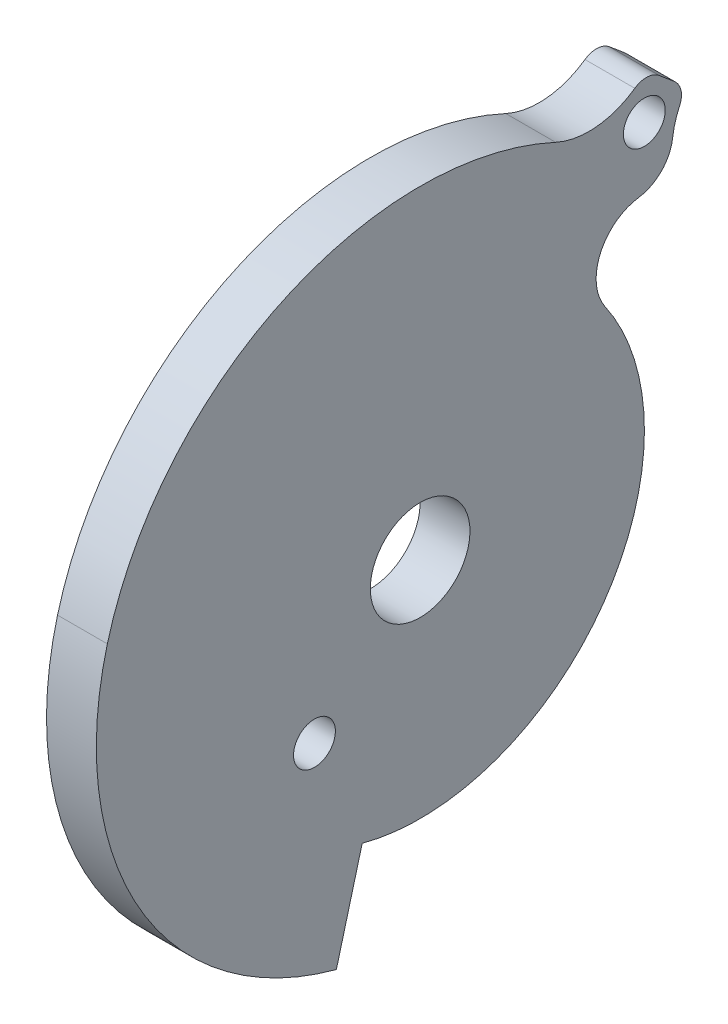
ISO-10303-21;
HEADER;
FILE_DESCRIPTION(('STEP AP214'),'2;1');
FILE_NAME('part.step','',(''),(''),'','','');
FILE_SCHEMA(('AUTOMOTIVE_DESIGN { 1 0 10303 214 1 1 1 1 }'));
ENDSEC;
DATA;
#1=APPLICATION_CONTEXT('core data for automotive mechanical design processes');
#2=APPLICATION_PROTOCOL_DEFINITION('international standard','automotive_design',2000,#1);
#3=PRODUCT_CONTEXT('',#1,'mechanical');
#4=PRODUCT('Part','Part','',(#3));
#5=PRODUCT_RELATED_PRODUCT_CATEGORY('part','',(#4));
#6=PRODUCT_DEFINITION_FORMATION('','',#4);
#7=PRODUCT_DEFINITION_CONTEXT('part definition',#1,'design');
#8=PRODUCT_DEFINITION('design','',#6,#7);
#9=PRODUCT_DEFINITION_SHAPE('','',#8);
#10=(LENGTH_UNIT() NAMED_UNIT(*) SI_UNIT(.MILLI.,.METRE.));
#11=(NAMED_UNIT(*) PLANE_ANGLE_UNIT() SI_UNIT($,.RADIAN.));
#12=(NAMED_UNIT(*) SI_UNIT($,.STERADIAN.) SOLID_ANGLE_UNIT());
#13=UNCERTAINTY_MEASURE_WITH_UNIT(LENGTH_MEASURE(1.E-05),#10,'distance_accuracy_value','');
#14=(GEOMETRIC_REPRESENTATION_CONTEXT(3) GLOBAL_UNCERTAINTY_ASSIGNED_CONTEXT((#13)) GLOBAL_UNIT_ASSIGNED_CONTEXT((#10,
#11,#12)) REPRESENTATION_CONTEXT('',''));
#15=CARTESIAN_POINT('',(0.,0.,0.));
#16=DIRECTION('',(0.,0.,1.));
#17=DIRECTION('',(1.,0.,0.));
#18=AXIS2_PLACEMENT_3D('',#15,#16,#17);
#19=CARTESIAN_POINT('',(0.,28.8354335294882,-25.5094848534449));
#20=DIRECTION('',(0.,0.766044443118984,-0.642787609686533));
#21=DIRECTION('',(-1.,0.,0.));
#22=AXIS2_PLACEMENT_3D('',#19,#20,#21);
#23=PLANE('',#22);
#24=DIRECTION('',(1.,0.,0.));
#25=VECTOR('',#24,1.);
#26=CARTESIAN_POINT('',(0.,30.1210087488613,-23.9773959672069));
#27=LINE('',#26,#25);
#28=CARTESIAN_POINT('',(-2.5,30.1210087488613,-23.9773959672069));
#29=VERTEX_POINT('',#28);
#30=CARTESIAN_POINT('',(2.5,30.1210087488613,-23.9773959672069));
#31=VERTEX_POINT('',#30);
#32=EDGE_CURVE('E125',#29,#31,#27,.T.);
#33=ORIENTED_EDGE('',*,*,#32,.T.);
#34=DIRECTION('',(0.,0.642787609686533,0.766044443118983));
#35=VECTOR('',#34,1.);
#36=CARTESIAN_POINT('',(2.5,28.8354335294882,-25.5094848534449));
#37=LINE('',#36,#35);
#38=CARTESIAN_POINT('',(2.5,28.8354335294882,-25.5094848534449));
#39=VERTEX_POINT('',#38);
#40=EDGE_CURVE('E217',#39,#31,#37,.T.);
#41=ORIENTED_EDGE('',*,*,#40,.F.);
#42=DIRECTION('',(1.,0.,0.));
#43=VECTOR('',#42,1.);
#44=CARTESIAN_POINT('',(0.,28.8354335294882,-25.5094848534449));
#45=LINE('',#44,#43);
#46=CARTESIAN_POINT('',(-2.5,28.8354335294882,-25.5094848534449));
#47=VERTEX_POINT('',#46);
#48=EDGE_CURVE('E170',#47,#39,#45,.T.);
#49=ORIENTED_EDGE('',*,*,#48,.F.);
#50=DIRECTION('',(0.,-0.642787609686533,-0.766044443118983));
#51=VECTOR('',#50,1.);
#52=CARTESIAN_POINT('',(-2.5,28.8354335294882,-25.5094848534449));
#53=LINE('',#52,#51);
#54=EDGE_CURVE('E135',#29,#47,#53,.T.);
#55=ORIENTED_EDGE('',*,*,#54,.F.);
#56=EDGE_LOOP('',(#33,#41,#49,#55));
#57=FACE_BOUND('',#56,.T.);
#58=ADVANCED_FACE('F17',(#57),#23,.T.);
#59=CARTESIAN_POINT('',(0.,-0.0144899209046523,0.00388256260460906));
#60=DIRECTION('',(1.,0.,0.));
#61=DIRECTION('',(0.,1.,0.));
#62=AXIS2_PLACEMENT_3D('',#59,#60,#61);
#63=CYLINDRICAL_SURFACE('',#62,32.5);
#64=DIRECTION('',(1.,0.,0.));
#65=VECTOR('',#64,1.);
#66=CARTESIAN_POINT('',(2.5,8.40437378099898,31.3945297997797));
#67=LINE('',#66,#65);
#68=CARTESIAN_POINT('',(-2.5,8.40437378100052,31.3945297997793));
#69=VERTEX_POINT('',#68);
#70=CARTESIAN_POINT('',(2.5,8.40437378100052,31.3945297997793));
#71=VERTEX_POINT('',#70);
#72=EDGE_CURVE('E21',#69,#71,#67,.T.);
#73=ORIENTED_EDGE('',*,*,#72,.T.);
#74=CARTESIAN_POINT('',(2.5,-0.0144899209046523,0.00388256260460906));
#75=DIRECTION('',(1.,0.,0.));
#76=DIRECTION('',(0.,1.,0.));
#77=AXIS2_PLACEMENT_3D('',#74,#75,#76);
#78=CIRCLE('',#77,32.5);
#79=CARTESIAN_POINT('',(2.5,29.5040355146327,-13.5941561236005));
#80=VERTEX_POINT('',#79);
#81=EDGE_CURVE('E152',#80,#71,#78,.T.);
#82=ORIENTED_EDGE('',*,*,#81,.F.);
#83=DIRECTION('',(1.,0.,0.));
#84=VECTOR('',#83,1.);
#85=CARTESIAN_POINT('',(0.,29.5040355146328,-13.5941561236005));
#86=LINE('',#85,#84);
#87=CARTESIAN_POINT('',(-2.5,29.5040355146327,-13.5941561236005));
#88=VERTEX_POINT('',#87);
#89=EDGE_CURVE('E126',#88,#80,#86,.T.);
#90=ORIENTED_EDGE('',*,*,#89,.F.);
#91=CARTESIAN_POINT('',(-2.5,-0.0144899209046523,0.00388256260460906));
#92=DIRECTION('',(-1.,0.,0.));
#93=DIRECTION('',(0.,1.,0.));
#94=AXIS2_PLACEMENT_3D('',#91,#92,#93);
#95=CIRCLE('',#94,32.5);
#96=EDGE_CURVE('E141',#69,#88,#95,.T.);
#97=ORIENTED_EDGE('',*,*,#96,.F.);
#98=EDGE_LOOP('',(#73,#82,#90,#97));
#99=FACE_BOUND('',#98,.T.);
#100=ADVANCED_FACE('F272',(#99),#63,.T.);
#101=CARTESIAN_POINT('',(0.,-10.6210916387027,10.610484280403));
#102=DIRECTION('',(1.,0.,0.));
#103=DIRECTION('',(0.,-1.,0.));
#104=AXIS2_PLACEMENT_3D('',#101,#102,#103);
#105=CYLINDRICAL_SURFACE('',#104,2.1);
#106=CARTESIAN_POINT('',(2.5,-10.6210916387027,10.610484280403));
#107=DIRECTION('',(-1.,0.,0.));
#108=DIRECTION('',(0.,-1.,0.));
#109=AXIS2_PLACEMENT_3D('',#106,#107,#108);
#110=CIRCLE('',#109,2.1);
#111=CARTESIAN_POINT('',(2.5,-8.52109163870272,10.610484280403));
#112=VERTEX_POINT('',#111);
#113=EDGE_CURVE('E163',#112,#112,#110,.T.);
#114=ORIENTED_EDGE('',*,*,#113,.F.);
#115=DIRECTION('',(-1.,0.,0.));
#116=VECTOR('',#115,1.);
#117=CARTESIAN_POINT('',(0.,-8.52109163870273,10.610484280403));
#118=LINE('',#117,#116);
#119=CARTESIAN_POINT('',(-2.5,-8.52109163870272,10.610484280403));
#120=VERTEX_POINT('',#119);
#121=EDGE_CURVE('E11',#112,#120,#118,.T.);
#122=ORIENTED_EDGE('',*,*,#121,.T.);
#123=CARTESIAN_POINT('',(-2.5,-10.6210916387027,10.610484280403));
#124=DIRECTION('',(1.,0.,0.));
#125=DIRECTION('',(0.,-1.,0.));
#126=AXIS2_PLACEMENT_3D('',#123,#124,#125);
#127=CIRCLE('',#126,2.1);
#128=EDGE_CURVE('E179',#120,#120,#127,.T.);
#129=ORIENTED_EDGE('',*,*,#128,.F.);
#130=ORIENTED_EDGE('',*,*,#121,.F.);
#131=EDGE_LOOP('',(#114,#122,#129,#130));
#132=FACE_BOUND('',#131,.T.);
#133=ADVANCED_FACE('F19',(#132),#105,.F.);
#134=CARTESIAN_POINT('',(0.,-0.0038825626047867,0.0038825626047867));
#135=DIRECTION('',(1.,0.,0.));
#136=DIRECTION('',(0.,-1.,0.));
#137=AXIS2_PLACEMENT_3D('',#134,#135,#136);
#138=CYLINDRICAL_SURFACE('',#137,5.);
#139=CARTESIAN_POINT('',(2.5,-0.0038825626047867,0.0038825626047867));
#140=DIRECTION('',(-1.,0.,0.));
#141=DIRECTION('',(0.,-1.,0.));
#142=AXIS2_PLACEMENT_3D('',#139,#140,#141);
#143=CIRCLE('',#142,5.);
#144=CARTESIAN_POINT('',(2.5,4.99611743739521,0.0038825626047867));
#145=VERTEX_POINT('',#144);
#146=EDGE_CURVE('E167',#145,#145,#143,.T.);
#147=ORIENTED_EDGE('',*,*,#146,.F.);
#148=DIRECTION('',(-1.,0.,0.));
#149=VECTOR('',#148,1.);
#150=CARTESIAN_POINT('',(0.,4.99611743739521,0.00388256260478731));
#151=LINE('',#150,#149);
#152=CARTESIAN_POINT('',(-2.5,4.99611743739521,0.0038825626047867));
#153=VERTEX_POINT('',#152);
#154=EDGE_CURVE('E28',#145,#153,#151,.T.);
#155=ORIENTED_EDGE('',*,*,#154,.T.);
#156=CARTESIAN_POINT('',(-2.5,-0.0038825626047867,0.0038825626047867));
#157=DIRECTION('',(1.,0.,0.));
#158=DIRECTION('',(0.,-1.,0.));
#159=AXIS2_PLACEMENT_3D('',#156,#157,#158);
#160=CIRCLE('',#159,5.);
#161=EDGE_CURVE('E184',#153,#153,#160,.T.);
#162=ORIENTED_EDGE('',*,*,#161,.F.);
#163=ORIENTED_EDGE('',*,*,#154,.F.);
#164=EDGE_LOOP('',(#147,#155,#162,#163));
#165=FACE_BOUND('',#164,.T.);
#166=ADVANCED_FACE('F373',(#165),#138,.F.);
#167=CARTESIAN_POINT('',(0.,26.7970655882598,-22.4936837764244));
#168=DIRECTION('',(1.,0.,0.));
#169=DIRECTION('',(0.,-1.,0.));
#170=AXIS2_PLACEMENT_3D('',#167,#168,#169);
#171=CYLINDRICAL_SURFACE('',#170,2.1);
#172=CARTESIAN_POINT('',(2.5,26.7970655882598,-22.4936837764244));
#173=DIRECTION('',(-1.,0.,0.));
#174=DIRECTION('',(0.,-1.,0.));
#175=AXIS2_PLACEMENT_3D('',#172,#173,#174);
#176=CIRCLE('',#175,2.1);
#177=CARTESIAN_POINT('',(2.5,28.8970655882598,-22.4936837764244));
#178=VERTEX_POINT('',#177);
#179=EDGE_CURVE('E226',#178,#178,#176,.T.);
#180=ORIENTED_EDGE('',*,*,#179,.F.);
#181=DIRECTION('',(-1.,0.,0.));
#182=VECTOR('',#181,1.);
#183=CARTESIAN_POINT('',(0.,28.8970655882598,-22.4936837764244));
#184=LINE('',#183,#182);
#185=CARTESIAN_POINT('',(-2.5,28.8970655882598,-22.4936837764244));
#186=VERTEX_POINT('',#185);
#187=EDGE_CURVE('E257',#178,#186,#184,.T.);
#188=ORIENTED_EDGE('',*,*,#187,.T.);
#189=CARTESIAN_POINT('',(-2.5,26.7970655882598,-22.4936837764244));
#190=DIRECTION('',(1.,0.,0.));
#191=DIRECTION('',(0.,-1.,0.));
#192=AXIS2_PLACEMENT_3D('',#189,#190,#191);
#193=CIRCLE('',#192,2.1);
#194=EDGE_CURVE('E188',#186,#186,#193,.T.);
#195=ORIENTED_EDGE('',*,*,#194,.F.);
#196=ORIENTED_EDGE('',*,*,#187,.F.);
#197=EDGE_LOOP('',(#180,#188,#195,#196));
#198=FACE_BOUND('',#197,.T.);
#199=ADVANCED_FACE('F367',(#198),#171,.F.);
#200=CARTESIAN_POINT('',(0.,28.5889198626233,-22.6918207478339));
#201=DIRECTION('',(1.,0.,0.));
#202=DIRECTION('',(0.,0.766044443118982,-0.642787609686534));
#203=AXIS2_PLACEMENT_3D('',#200,#201,#202);
#204=CYLINDRICAL_SURFACE('',#203,2.);
#205=DIRECTION('',(-1.,0.,0.));
#206=VECTOR('',#205,1.);
#207=CARTESIAN_POINT('',(0.,30.2251627067747,-21.5417297275388));
#208=LINE('',#207,#206);
#209=CARTESIAN_POINT('',(2.5,30.2251627067747,-21.5417297275388));
#210=VERTEX_POINT('',#209);
#211=CARTESIAN_POINT('',(-2.5,30.2251627067747,-21.5417297275388));
#212=VERTEX_POINT('',#211);
#213=EDGE_CURVE('E113',#210,#212,#208,.T.);
#214=ORIENTED_EDGE('',*,*,#213,.F.);
#215=CARTESIAN_POINT('',(2.5,28.5889198626233,-22.6918207478339));
#216=DIRECTION('',(1.,0.,0.));
#217=DIRECTION('',(0.,0.766044443118982,-0.642787609686534));
#218=AXIS2_PLACEMENT_3D('',#215,#216,#217);
#219=CIRCLE('',#218,2.);
#220=EDGE_CURVE('E214',#31,#210,#219,.T.);
#221=ORIENTED_EDGE('',*,*,#220,.F.);
#222=ORIENTED_EDGE('',*,*,#32,.F.);
#223=CARTESIAN_POINT('',(-2.5,28.5889198626233,-22.6918207478339));
#224=DIRECTION('',(-1.,0.,0.));
#225=DIRECTION('',(0.,0.766044443118982,-0.642787609686534));
#226=AXIS2_PLACEMENT_3D('',#223,#224,#225);
#227=CIRCLE('',#226,2.);
#228=EDGE_CURVE('E128',#212,#29,#227,.T.);
#229=ORIENTED_EDGE('',*,*,#228,.F.);
#230=EDGE_LOOP('',(#214,#221,#222,#229));
#231=FACE_BOUND('',#230,.T.);
#232=ADVANCED_FACE('F129',(#231),#204,.T.);
#233=CARTESIAN_POINT('',(0.,36.7701340833804,-16.9413656463587));
#234=DIRECTION('',(-1.,0.,0.));
#235=DIRECTION('',(0.,0.818121422075711,0.575045510147516));
#236=AXIS2_PLACEMENT_3D('',#233,#234,#235);
#237=CYLINDRICAL_SURFACE('',#236,8.);
#238=CARTESIAN_POINT('',(-2.5,36.7701340833804,-16.9413656463587));
#239=DIRECTION('',(1.,0.,0.));
#240=DIRECTION('',(0.,0.818121422075711,0.575045510147516));
#241=AXIS2_PLACEMENT_3D('',#238,#239,#240);
#242=CIRCLE('',#241,8.);
#243=EDGE_CURVE('E117',#88,#212,#242,.T.);
#244=ORIENTED_EDGE('',*,*,#243,.F.);
#245=ORIENTED_EDGE('',*,*,#89,.T.);
#246=CARTESIAN_POINT('',(2.5,36.7701340833804,-16.9413656463587));
#247=DIRECTION('',(1.,0.,0.));
#248=DIRECTION('',(0.,0.818121422075711,0.575045510147516));
#249=AXIS2_PLACEMENT_3D('',#246,#247,#248);
#250=CIRCLE('',#249,8.);
#251=EDGE_CURVE('E120',#80,#210,#250,.T.);
#252=ORIENTED_EDGE('',*,*,#251,.T.);
#253=ORIENTED_EDGE('',*,*,#213,.T.);
#254=EDGE_LOOP('',(#244,#245,#252,#253));
#255=FACE_BOUND('',#254,.T.);
#256=ADVANCED_FACE('F115',(#255),#237,.F.);
#257=CARTESIAN_POINT('',(0.,27.3033446432503,-24.2239096340718));
#258=DIRECTION('',(1.,0.,0.));
#259=DIRECTION('',(0.,-0.642787609686537,-0.76604444311898));
#260=AXIS2_PLACEMENT_3D('',#257,#258,#259);
#261=CYLINDRICAL_SURFACE('',#260,2.);
#262=DIRECTION('',(1.,0.,0.));
#263=VECTOR('',#262,1.);
#264=CARTESIAN_POINT('',(0.,26.4548566779015,-26.0350054826282));
#265=LINE('',#264,#263);
#266=CARTESIAN_POINT('',(-2.5,26.4548566779015,-26.0350054826282));
#267=VERTEX_POINT('',#266);
#268=CARTESIAN_POINT('',(2.5,26.4548566779015,-26.0350054826282));
#269=VERTEX_POINT('',#268);
#270=EDGE_CURVE('E166',#267,#269,#265,.T.);
#271=ORIENTED_EDGE('',*,*,#270,.F.);
#272=CARTESIAN_POINT('',(-2.5,27.3033446432503,-24.2239096340718));
#273=DIRECTION('',(-1.,0.,0.));
#274=DIRECTION('',(0.,-0.642787609686537,-0.76604444311898));
#275=AXIS2_PLACEMENT_3D('',#272,#273,#274);
#276=CIRCLE('',#275,2.);
#277=EDGE_CURVE('E218',#47,#267,#276,.T.);
#278=ORIENTED_EDGE('',*,*,#277,.F.);
#279=ORIENTED_EDGE('',*,*,#48,.T.);
#280=CARTESIAN_POINT('',(2.5,27.3033446432503,-24.2239096340718));
#281=DIRECTION('',(1.,0.,0.));
#282=DIRECTION('',(0.,-0.642787609686537,-0.76604444311898));
#283=AXIS2_PLACEMENT_3D('',#280,#281,#282);
#284=CIRCLE('',#283,2.);
#285=EDGE_CURVE('E199',#269,#39,#284,.T.);
#286=ORIENTED_EDGE('',*,*,#285,.F.);
#287=EDGE_LOOP('',(#271,#278,#279,#286));
#288=FACE_BOUND('',#287,.T.);
#289=ADVANCED_FACE('F338',(#288),#261,.T.);
#290=CARTESIAN_POINT('',(0.,23.0609048165062,-33.2793888768538));
#291=DIRECTION('',(1.,0.,0.));
#292=DIRECTION('',(0.,-0.424243982674403,-0.905547924278203));
#293=AXIS2_PLACEMENT_3D('',#290,#291,#292);
#294=CYLINDRICAL_SURFACE('',#293,8.);
#295=DIRECTION('',(1.,0.,0.));
#296=VECTOR('',#295,1.);
#297=CARTESIAN_POINT('',(0.,24.0194259558783,-25.3370191281342));
#298=LINE('',#297,#296);
#299=CARTESIAN_POINT('',(-2.5,24.0194259558783,-25.3370191281342));
#300=VERTEX_POINT('',#299);
#301=CARTESIAN_POINT('',(2.5,24.0194259558783,-25.3370191281342));
#302=VERTEX_POINT('',#301);
#303=EDGE_CURVE('E209',#300,#302,#298,.T.);
#304=ORIENTED_EDGE('',*,*,#303,.F.);
#305=CARTESIAN_POINT('',(-2.5,23.0609048165062,-33.2793888768538));
#306=DIRECTION('',(-1.,0.,0.));
#307=DIRECTION('',(0.,-0.424243982674403,-0.905547924278203));
#308=AXIS2_PLACEMENT_3D('',#305,#306,#307);
#309=CIRCLE('',#308,8.);
#310=EDGE_CURVE('E222',#300,#267,#309,.T.);
#311=ORIENTED_EDGE('',*,*,#310,.T.);
#312=ORIENTED_EDGE('',*,*,#270,.T.);
#313=CARTESIAN_POINT('',(2.5,23.0609048165062,-33.2793888768538));
#314=DIRECTION('',(-1.,0.,0.));
#315=DIRECTION('',(0.,-0.424243982674403,-0.905547924278203));
#316=AXIS2_PLACEMENT_3D('',#313,#314,#315);
#317=CIRCLE('',#316,8.);
#318=EDGE_CURVE('E162',#302,#269,#317,.T.);
#319=ORIENTED_EDGE('',*,*,#318,.F.);
#320=EDGE_LOOP('',(#304,#311,#312,#319));
#321=FACE_BOUND('',#320,.T.);
#322=ADVANCED_FACE('F339',(#321),#294,.F.);
#323=CARTESIAN_POINT('',(2.5,-4.77135319305156,-12.0403079544793));
#324=DIRECTION('',(1.,0.,0.));
#325=DIRECTION('',(0.,1.,0.));
#326=AXIS2_PLACEMENT_3D('',#323,#324,#325);
#327=PLANE('',#326);
#328=ORIENTED_EDGE('',*,*,#113,.T.);
#329=EDGE_LOOP('',(#328));
#330=FACE_BOUND('',#329,.T.);
#331=ORIENTED_EDGE('',*,*,#146,.T.);
#332=EDGE_LOOP('',(#331));
#333=FACE_BOUND('',#332,.T.);
#334=ORIENTED_EDGE('',*,*,#179,.T.);
#335=EDGE_LOOP('',(#334));
#336=FACE_BOUND('',#335,.T.);
#337=CARTESIAN_POINT('',(2.5,24.4986865255644,-21.3658342537744));
#338=DIRECTION('',(-1.,0.,0.));
#339=DIRECTION('',(0.,-0.698989310309258,-0.715132116516513));
#340=AXIS2_PLACEMENT_3D('',#337,#338,#339);
#341=CIRCLE('',#340,4.);
#342=CARTESIAN_POINT('',(2.5,20.5394770097124,-21.9356236969785));
#343=VERTEX_POINT('',#342);
#344=EDGE_CURVE('E158',#302,#343,#341,.T.);
#345=ORIENTED_EDGE('',*,*,#344,.F.);
#346=ORIENTED_EDGE('',*,*,#318,.T.);
#347=ORIENTED_EDGE('',*,*,#285,.T.);
#348=ORIENTED_EDGE('',*,*,#40,.T.);
#349=ORIENTED_EDGE('',*,*,#220,.T.);
#350=ORIENTED_EDGE('',*,*,#251,.F.);
#351=ORIENTED_EDGE('',*,*,#81,.T.);
#352=CARTESIAN_POINT('',(2.5,0.,0.));
#353=DIRECTION('',(1.,0.,0.));
#354=DIRECTION('',(0.,0.,1.));
#355=AXIS2_PLACEMENT_3D('',#352,#353,#354);
#356=CIRCLE('',#355,32.5);
#357=CARTESIAN_POINT('',(2.5,-31.3925893543948,8.41161896583211));
#358=VERTEX_POINT('',#357);
#359=EDGE_CURVE('E204',#71,#358,#356,.T.);
#360=ORIENTED_EDGE('',*,*,#359,.T.);
#361=DIRECTION('',(0.,0.965925826289068,-0.258819045102521));
#362=VECTOR('',#361,1.);
#363=CARTESIAN_POINT('',(2.5,-16.417122750053,4.39895478291948));
#364=LINE('',#363,#362);
#365=CARTESIAN_POINT('',(2.5,-21.7188411705994,5.8195459522021));
#366=VERTEX_POINT('',#365);
#367=EDGE_CURVE('E195',#358,#366,#364,.T.);
#368=ORIENTED_EDGE('',*,*,#367,.T.);
#369=CARTESIAN_POINT('',(2.5,0.0144899209046486,-0.00388256260463522));
#370=DIRECTION('',(1.,0.,0.));
#371=DIRECTION('',(0.,0.,1.));
#372=AXIS2_PLACEMENT_3D('',#369,#370,#371);
#373=CIRCLE('',#372,22.5);
#374=CARTESIAN_POINT('',(2.5,12.8240050881614,-18.5016208346156));
#375=VERTEX_POINT('',#374);
#376=EDGE_CURVE('E159',#366,#375,#373,.T.);
#377=ORIENTED_EDGE('',*,*,#376,.T.);
#378=CARTESIAN_POINT('',(2.5,15.6012246905565,-22.6463120371806));
#379=DIRECTION('',(-1.,0.,0.));
#380=DIRECTION('',(0.,0.581579896852276,-0.813489289159541));
#381=AXIS2_PLACEMENT_3D('',#378,#379,#380);
#382=CIRCLE('',#381,4.98912957183389);
#383=EDGE_CURVE('E183',#375,#343,#382,.T.);
#384=ORIENTED_EDGE('',*,*,#383,.T.);
#385=EDGE_LOOP('',(#345,#346,#347,#348,#349,#350,#351,#360,#368,#377,#384));
#386=FACE_BOUND('',#385,.T.);
#387=ADVANCED_FACE('F267',(#330,#333,#336,#386),#327,.T.);
#388=CARTESIAN_POINT('',(2.5,0.0144899209046486,-0.00388256260463522));
#389=DIRECTION('',(-1.,0.,0.));
#390=DIRECTION('',(0.,-0.575702960327119,-0.817658915117173));
#391=AXIS2_PLACEMENT_3D('',#388,#389,#390);
#392=CYLINDRICAL_SURFACE('',#391,22.5);
#393=ORIENTED_EDGE('',*,*,#376,.F.);
#394=DIRECTION('',(-1.,0.,0.));
#395=VECTOR('',#394,1.);
#396=CARTESIAN_POINT('',(2.5,-21.7188411705994,5.8195459522021));
#397=LINE('',#396,#395);
#398=CARTESIAN_POINT('',(-2.5,-21.7188411705994,5.8195459522021));
#399=VERTEX_POINT('',#398);
#400=EDGE_CURVE('E200',#366,#399,#397,.T.);
#401=ORIENTED_EDGE('',*,*,#400,.T.);
#402=CARTESIAN_POINT('',(-2.5,0.0144899209046486,-0.00388256260463522));
#403=DIRECTION('',(-1.,0.,0.));
#404=DIRECTION('',(0.,0.,1.));
#405=AXIS2_PLACEMENT_3D('',#402,#403,#404);
#406=CIRCLE('',#405,22.5);
#407=CARTESIAN_POINT('',(-2.5,12.8240050881614,-18.5016208346156));
#408=VERTEX_POINT('',#407);
#409=EDGE_CURVE('E174',#408,#399,#406,.T.);
#410=ORIENTED_EDGE('',*,*,#409,.F.);
#411=DIRECTION('',(-1.,0.,0.));
#412=VECTOR('',#411,1.);
#413=CARTESIAN_POINT('',(2.5,12.8240050881614,-18.5016208346156));
#414=LINE('',#413,#412);
#415=EDGE_CURVE('E192',#375,#408,#414,.T.);
#416=ORIENTED_EDGE('',*,*,#415,.F.);
#417=EDGE_LOOP('',(#393,#401,#410,#416));
#418=FACE_BOUND('',#417,.T.);
#419=ADVANCED_FACE('F347',(#418),#392,.T.);
#420=CARTESIAN_POINT('',(2.5,0.,0.));
#421=DIRECTION('',(-1.,0.,0.));
#422=DIRECTION('',(0.,0.,1.));
#423=AXIS2_PLACEMENT_3D('',#420,#421,#422);
#424=CYLINDRICAL_SURFACE('',#423,32.5);
#425=ORIENTED_EDGE('',*,*,#359,.F.);
#426=ORIENTED_EDGE('',*,*,#72,.F.);
#427=CARTESIAN_POINT('',(-2.5,0.,0.));
#428=DIRECTION('',(-1.,0.,0.));
#429=DIRECTION('',(0.,0.,1.));
#430=AXIS2_PLACEMENT_3D('',#427,#428,#429);
#431=CIRCLE('',#430,32.5);
#432=CARTESIAN_POINT('',(-2.5,-31.3925893543948,8.41161896583211));
#433=VERTEX_POINT('',#432);
#434=EDGE_CURVE('E148',#433,#69,#431,.T.);
#435=ORIENTED_EDGE('',*,*,#434,.F.);
#436=DIRECTION('',(-1.,0.,0.));
#437=VECTOR('',#436,1.);
#438=CARTESIAN_POINT('',(2.5,-31.3925893543948,8.41161896583211));
#439=LINE('',#438,#437);
#440=EDGE_CURVE('E205',#358,#433,#439,.T.);
#441=ORIENTED_EDGE('',*,*,#440,.F.);
#442=EDGE_LOOP('',(#425,#426,#435,#441));
#443=FACE_BOUND('',#442,.T.);
#444=ADVANCED_FACE('F276',(#443),#424,.T.);
#445=CARTESIAN_POINT('',(2.5,-31.3925893543947,8.41161896583211));
#446=DIRECTION('',(0.,0.258819045102521,0.965925826289068));
#447=DIRECTION('',(1.,0.,0.));
#448=AXIS2_PLACEMENT_3D('',#445,#446,#447);
#449=PLANE('',#448);
#450=ORIENTED_EDGE('',*,*,#367,.F.);
#451=ORIENTED_EDGE('',*,*,#440,.T.);
#452=DIRECTION('',(0.,-0.965925826289068,0.258819045102521));
#453=VECTOR('',#452,1.);
#454=CARTESIAN_POINT('',(-2.5,-16.417122750053,4.39895478291948));
#455=LINE('',#454,#453);
#456=EDGE_CURVE('E178',#399,#433,#455,.T.);
#457=ORIENTED_EDGE('',*,*,#456,.F.);
#458=ORIENTED_EDGE('',*,*,#400,.F.);
#459=EDGE_LOOP('',(#450,#451,#457,#458));
#460=FACE_BOUND('',#459,.T.);
#461=ADVANCED_FACE('F310',(#460),#449,.F.);
#462=CARTESIAN_POINT('',(2.5,15.6012246905565,-22.6463120371806));
#463=DIRECTION('',(-1.,0.,0.));
#464=DIRECTION('',(0.,0.581579896852276,-0.813489289159541));
#465=AXIS2_PLACEMENT_3D('',#462,#463,#464);
#466=CYLINDRICAL_SURFACE('',#465,4.98912957183389);
#467=DIRECTION('',(-1.,0.,0.));
#468=VECTOR('',#467,1.);
#469=CARTESIAN_POINT('',(0.,20.5394770097124,-21.9356236969785));
#470=LINE('',#469,#468);
#471=CARTESIAN_POINT('',(-2.5,20.5394770097124,-21.9356236969785));
#472=VERTEX_POINT('',#471);
#473=EDGE_CURVE('E154',#343,#472,#470,.T.);
#474=ORIENTED_EDGE('',*,*,#473,.F.);
#475=ORIENTED_EDGE('',*,*,#383,.F.);
#476=ORIENTED_EDGE('',*,*,#415,.T.);
#477=CARTESIAN_POINT('',(-2.5,15.6012246905565,-22.6463120371806));
#478=DIRECTION('',(1.,0.,0.));
#479=DIRECTION('',(0.,0.581579896852276,-0.813489289159541));
#480=AXIS2_PLACEMENT_3D('',#477,#478,#479);
#481=CIRCLE('',#480,4.98912957183389);
#482=EDGE_CURVE('E157',#472,#408,#481,.T.);
#483=ORIENTED_EDGE('',*,*,#482,.F.);
#484=EDGE_LOOP('',(#474,#475,#476,#483));
#485=FACE_BOUND('',#484,.T.);
#486=ADVANCED_FACE('F344',(#485),#466,.F.);
#487=CARTESIAN_POINT('',(-2.5,-4.77135319305156,-12.0403079544793));
#488=DIRECTION('',(1.,0.,0.));
#489=DIRECTION('',(0.,1.,0.));
#490=AXIS2_PLACEMENT_3D('',#487,#488,#489);
#491=PLANE('',#490);
#492=ORIENTED_EDGE('',*,*,#128,.T.);
#493=EDGE_LOOP('',(#492));
#494=FACE_BOUND('',#493,.T.);
#495=ORIENTED_EDGE('',*,*,#161,.T.);
#496=EDGE_LOOP('',(#495));
#497=FACE_BOUND('',#496,.T.);
#498=ORIENTED_EDGE('',*,*,#194,.T.);
#499=EDGE_LOOP('',(#498));
#500=FACE_BOUND('',#499,.T.);
#501=CARTESIAN_POINT('',(-2.5,24.4986865255644,-21.3658342537744));
#502=DIRECTION('',(1.,0.,0.));
#503=DIRECTION('',(0.,-0.698989310309258,-0.715132116516513));
#504=AXIS2_PLACEMENT_3D('',#501,#502,#503);
#505=CIRCLE('',#504,4.);
#506=EDGE_CURVE('E206',#472,#300,#505,.T.);
#507=ORIENTED_EDGE('',*,*,#506,.F.);
#508=ORIENTED_EDGE('',*,*,#482,.T.);
#509=ORIENTED_EDGE('',*,*,#409,.T.);
#510=ORIENTED_EDGE('',*,*,#456,.T.);
#511=ORIENTED_EDGE('',*,*,#434,.T.);
#512=ORIENTED_EDGE('',*,*,#96,.T.);
#513=ORIENTED_EDGE('',*,*,#243,.T.);
#514=ORIENTED_EDGE('',*,*,#228,.T.);
#515=ORIENTED_EDGE('',*,*,#54,.T.);
#516=ORIENTED_EDGE('',*,*,#277,.T.);
#517=ORIENTED_EDGE('',*,*,#310,.F.);
#518=EDGE_LOOP('',(#507,#508,#509,#510,#511,#512,#513,#514,#515,#516,#517));
#519=FACE_BOUND('',#518,.T.);
#520=ADVANCED_FACE('F138',(#494,#497,#500,#519),#491,.F.);
#521=CARTESIAN_POINT('',(0.,24.4986865255644,-21.3658342537744));
#522=DIRECTION('',(-1.,0.,0.));
#523=DIRECTION('',(0.,-0.698989310309258,-0.715132116516513));
#524=AXIS2_PLACEMENT_3D('',#521,#522,#523);
#525=CYLINDRICAL_SURFACE('',#524,4.);
#526=ORIENTED_EDGE('',*,*,#506,.T.);
#527=ORIENTED_EDGE('',*,*,#303,.T.);
#528=ORIENTED_EDGE('',*,*,#344,.T.);
#529=ORIENTED_EDGE('',*,*,#473,.T.);
#530=EDGE_LOOP('',(#526,#527,#528,#529));
#531=FACE_BOUND('',#530,.T.);
#532=ADVANCED_FACE('F340',(#531),#525,.T.);
#533=CLOSED_SHELL('',(#58,#100,#133,#166,#199,#232,#256,#289,#322,#387,#419,#444,#461,#486,#520,#532));
#534=MANIFOLD_SOLID_BREP('B1',#533);
#535=ADVANCED_BREP_SHAPE_REPRESENTATION('',(#18,#534),#14);
#536=SHAPE_DEFINITION_REPRESENTATION(#9,#535);
ENDSEC;
END-ISO-10303-21;
